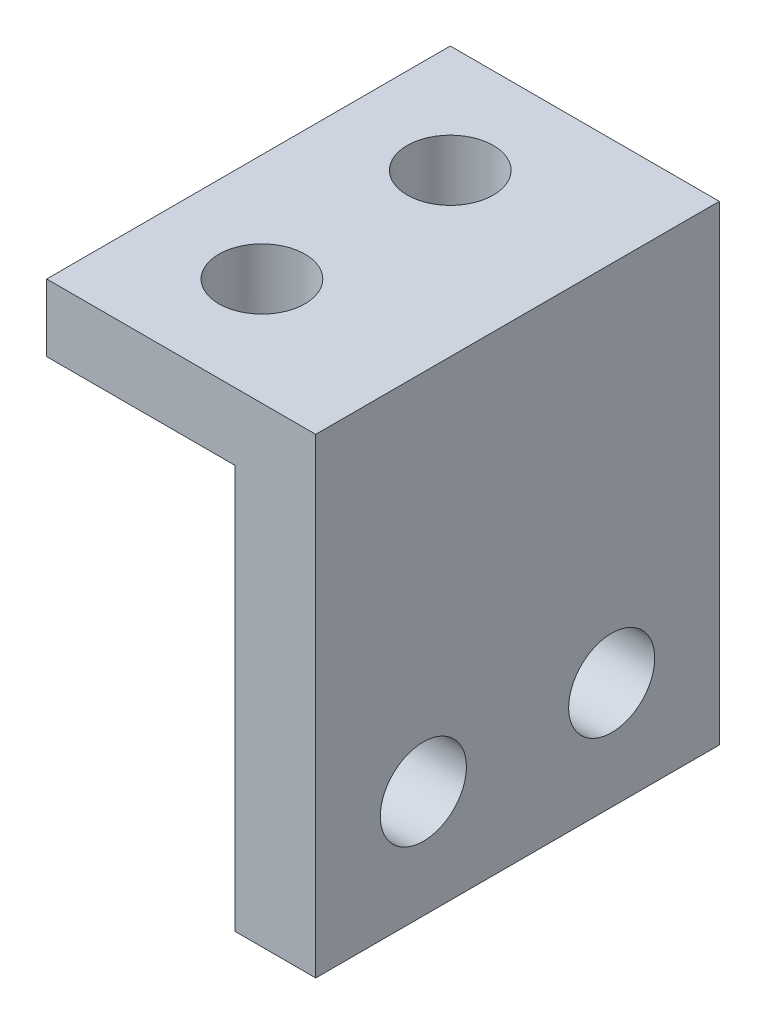
ISO-10303-21;
HEADER;
FILE_DESCRIPTION(('STEP AP214'),'2;1');
FILE_NAME('part.step','',(''),(''),'','','');
FILE_SCHEMA(('AUTOMOTIVE_DESIGN { 1 0 10303 214 1 1 1 1 }'));
ENDSEC;
DATA;
#1=APPLICATION_CONTEXT('core data for automotive mechanical design processes');
#2=APPLICATION_PROTOCOL_DEFINITION('international standard','automotive_design',2000,#1);
#3=PRODUCT_CONTEXT('',#1,'mechanical');
#4=PRODUCT('Part','Part','',(#3));
#5=PRODUCT_RELATED_PRODUCT_CATEGORY('part','',(#4));
#6=PRODUCT_DEFINITION_FORMATION('','',#4);
#7=PRODUCT_DEFINITION_CONTEXT('part definition',#1,'design');
#8=PRODUCT_DEFINITION('design','',#6,#7);
#9=PRODUCT_DEFINITION_SHAPE('','',#8);
#10=(LENGTH_UNIT() NAMED_UNIT(*) SI_UNIT(.MILLI.,.METRE.));
#11=(NAMED_UNIT(*) PLANE_ANGLE_UNIT() SI_UNIT($,.RADIAN.));
#12=(NAMED_UNIT(*) SI_UNIT($,.STERADIAN.) SOLID_ANGLE_UNIT());
#13=UNCERTAINTY_MEASURE_WITH_UNIT(LENGTH_MEASURE(1.E-05),#10,'distance_accuracy_value','');
#14=(GEOMETRIC_REPRESENTATION_CONTEXT(3) GLOBAL_UNCERTAINTY_ASSIGNED_CONTEXT((#13)) GLOBAL_UNIT_ASSIGNED_CONTEXT((#10,
#11,#12)) REPRESENTATION_CONTEXT('',''));
#15=CARTESIAN_POINT('',(0.,0.,0.));
#16=DIRECTION('',(0.,0.,1.));
#17=DIRECTION('',(1.,0.,0.));
#18=AXIS2_PLACEMENT_3D('',#15,#16,#17);
#19=CARTESIAN_POINT('',(0.,-15.,7.5));
#20=DIRECTION('',(1.,0.,0.));
#21=DIRECTION('',(0.,0.,-1.));
#22=AXIS2_PLACEMENT_3D('',#19,#20,#21);
#23=PLANE('',#22);
#24=DIRECTION('',(0.,0.,-1.));
#25=VECTOR('',#24,1.);
#26=CARTESIAN_POINT('',(0.,0.,7.5));
#27=LINE('',#26,#25);
#28=CARTESIAN_POINT('',(0.,0.,7.5));
#29=VERTEX_POINT('',#28);
#30=CARTESIAN_POINT('',(0.,0.,5.33303027798234));
#31=VERTEX_POINT('',#30);
#32=EDGE_CURVE('E207',#29,#31,#27,.T.);
#33=ORIENTED_EDGE('',*,*,#32,.T.);
#34=DIRECTION('',(0.,-1.,0.));
#35=VECTOR('',#34,1.);
#36=CARTESIAN_POINT('',(0.,7.07106781186548,5.33303027798234));
#37=LINE('',#36,#35);
#38=CARTESIAN_POINT('',(0.,-15.,5.33303027798234));
#39=VERTEX_POINT('',#38);
#40=EDGE_CURVE('E235',#31,#39,#37,.T.);
#41=ORIENTED_EDGE('',*,*,#40,.T.);
#42=DIRECTION('',(0.,0.,-1.));
#43=VECTOR('',#42,1.);
#44=CARTESIAN_POINT('',(0.,-15.,7.5));
#45=LINE('',#44,#43);
#46=CARTESIAN_POINT('',(0.,-15.,7.5));
#47=VERTEX_POINT('',#46);
#48=EDGE_CURVE('E11',#47,#39,#45,.T.);
#49=ORIENTED_EDGE('',*,*,#48,.F.);
#50=DIRECTION('',(0.,-1.,0.));
#51=VECTOR('',#50,1.);
#52=CARTESIAN_POINT('',(0.,-15.,7.5));
#53=LINE('',#52,#51);
#54=EDGE_CURVE('E206',#29,#47,#53,.T.);
#55=ORIENTED_EDGE('',*,*,#54,.F.);
#56=EDGE_LOOP('',(#33,#41,#49,#55));
#57=FACE_BOUND('',#56,.T.);
#58=ADVANCED_FACE('F37',(#57),#23,.F.);
#59=CARTESIAN_POINT('',(0.,-15.,1.66696972201766));
#60=VERTEX_POINT('',#59);
#61=CARTESIAN_POINT('',(0.,-15.,-1.66696972201766));
#62=VERTEX_POINT('',#61);
#63=EDGE_CURVE('E51',#60,#62,#45,.T.);
#64=ORIENTED_EDGE('',*,*,#63,.F.);
#65=DIRECTION('',(0.,-1.,0.));
#66=VECTOR('',#65,1.);
#67=CARTESIAN_POINT('',(0.,7.07106781186548,1.66696972201766));
#68=LINE('',#67,#66);
#69=CARTESIAN_POINT('',(0.,0.,1.66696972201766));
#70=VERTEX_POINT('',#69);
#71=EDGE_CURVE('E68',#60,#70,#68,.F.);
#72=ORIENTED_EDGE('',*,*,#71,.T.);
#73=CARTESIAN_POINT('',(0.,0.,-1.66696972201766));
#74=VERTEX_POINT('',#73);
#75=EDGE_CURVE('E135',#70,#74,#27,.T.);
#76=ORIENTED_EDGE('',*,*,#75,.T.);
#77=DIRECTION('',(0.,-1.,0.));
#78=VECTOR('',#77,1.);
#79=CARTESIAN_POINT('',(0.,7.07106781186548,-1.66696972201766));
#80=LINE('',#79,#78);
#81=EDGE_CURVE('E122',#74,#62,#80,.T.);
#82=ORIENTED_EDGE('',*,*,#81,.T.);
#83=EDGE_LOOP('',(#64,#72,#76,#82));
#84=FACE_BOUND('',#83,.T.);
#85=ADVANCED_FACE('F133',(#84),#23,.F.);
#86=CARTESIAN_POINT('',(0.,-15.,-5.33303027798234));
#87=VERTEX_POINT('',#86);
#88=CARTESIAN_POINT('',(0.,-15.,-7.5));
#89=VERTEX_POINT('',#88);
#90=EDGE_CURVE('E53',#87,#89,#45,.T.);
#91=ORIENTED_EDGE('',*,*,#90,.F.);
#92=DIRECTION('',(0.,-1.,0.));
#93=VECTOR('',#92,1.);
#94=CARTESIAN_POINT('',(0.,7.07106781186548,-5.33303027798234));
#95=LINE('',#94,#93);
#96=CARTESIAN_POINT('',(0.,0.,-5.33303027798234));
#97=VERTEX_POINT('',#96);
#98=EDGE_CURVE('E60',#87,#97,#95,.F.);
#99=ORIENTED_EDGE('',*,*,#98,.T.);
#100=CARTESIAN_POINT('',(0.,0.,-7.5));
#101=VERTEX_POINT('',#100);
#102=EDGE_CURVE('E210',#97,#101,#27,.T.);
#103=ORIENTED_EDGE('',*,*,#102,.T.);
#104=DIRECTION('',(0.,-1.,0.));
#105=VECTOR('',#104,1.);
#106=CARTESIAN_POINT('',(0.,-15.,-7.5));
#107=LINE('',#106,#105);
#108=EDGE_CURVE('E148',#101,#89,#107,.T.);
#109=ORIENTED_EDGE('',*,*,#108,.T.);
#110=EDGE_LOOP('',(#91,#99,#103,#109));
#111=FACE_BOUND('',#110,.T.);
#112=ADVANCED_FACE('F39',(#111),#23,.F.);
#113=CARTESIAN_POINT('',(3.,-15.,7.5));
#114=DIRECTION('',(0.,1.,0.));
#115=DIRECTION('',(0.,0.,1.));
#116=AXIS2_PLACEMENT_3D('',#113,#114,#115);
#117=PLANE('',#116);
#118=ORIENTED_EDGE('',*,*,#48,.T.);
#119=CARTESIAN_POINT('',(-1.7,-15.,3.5));
#120=DIRECTION('',(0.,-1.,0.));
#121=DIRECTION('',(0.,0.,-1.));
#122=AXIS2_PLACEMENT_3D('',#119,#120,#121);
#123=CIRCLE('',#122,2.5);
#124=EDGE_CURVE('E127',#60,#39,#123,.T.);
#125=ORIENTED_EDGE('',*,*,#124,.F.);
#126=ORIENTED_EDGE('',*,*,#63,.T.);
#127=CARTESIAN_POINT('',(-1.7,-15.,-3.5));
#128=DIRECTION('',(0.,-1.,0.));
#129=DIRECTION('',(0.,0.,-1.));
#130=AXIS2_PLACEMENT_3D('',#127,#128,#129);
#131=CIRCLE('',#130,2.5);
#132=EDGE_CURVE('E119',#87,#62,#131,.T.);
#133=ORIENTED_EDGE('',*,*,#132,.F.);
#134=ORIENTED_EDGE('',*,*,#90,.T.);
#135=DIRECTION('',(1.,0.,0.));
#136=VECTOR('',#135,1.);
#137=CARTESIAN_POINT('',(3.,-15.,-7.5));
#138=LINE('',#137,#136);
#139=CARTESIAN_POINT('',(3.,-15.,-7.5));
#140=VERTEX_POINT('',#139);
#141=EDGE_CURVE('E186',#89,#140,#138,.T.);
#142=ORIENTED_EDGE('',*,*,#141,.T.);
#143=DIRECTION('',(0.,0.,-1.));
#144=VECTOR('',#143,1.);
#145=CARTESIAN_POINT('',(3.,-15.,7.5));
#146=LINE('',#145,#144);
#147=CARTESIAN_POINT('',(3.,-15.,7.5));
#148=VERTEX_POINT('',#147);
#149=EDGE_CURVE('E138',#148,#140,#146,.T.);
#150=ORIENTED_EDGE('',*,*,#149,.F.);
#151=DIRECTION('',(1.,0.,0.));
#152=VECTOR('',#151,1.);
#153=CARTESIAN_POINT('',(3.,-15.,7.5));
#154=LINE('',#153,#152);
#155=EDGE_CURVE('E223',#47,#148,#154,.T.);
#156=ORIENTED_EDGE('',*,*,#155,.F.);
#157=EDGE_LOOP('',(#118,#125,#126,#133,#134,#142,#150,#156));
#158=FACE_BOUND('',#157,.T.);
#159=ADVANCED_FACE('F137',(#158),#117,.F.);
#160=CARTESIAN_POINT('',(3.,2.5,7.5));
#161=DIRECTION('',(-1.,0.,0.));
#162=DIRECTION('',(0.,-1.,0.));
#163=AXIS2_PLACEMENT_3D('',#160,#161,#162);
#164=PLANE('',#163);
#165=CARTESIAN_POINT('',(3.,-11.,-3.5));
#166=DIRECTION('',(1.,0.,0.));
#167=DIRECTION('',(0.,1.,0.));
#168=AXIS2_PLACEMENT_3D('',#165,#166,#167);
#169=CIRCLE('',#168,1.6);
#170=CARTESIAN_POINT('',(3.,-9.4,-3.5));
#171=VERTEX_POINT('',#170);
#172=EDGE_CURVE('E240',#171,#171,#169,.T.);
#173=ORIENTED_EDGE('',*,*,#172,.F.);
#174=EDGE_LOOP('',(#173));
#175=FACE_BOUND('',#174,.T.);
#176=CARTESIAN_POINT('',(3.,-11.,3.5));
#177=DIRECTION('',(1.,0.,0.));
#178=DIRECTION('',(0.,1.,0.));
#179=AXIS2_PLACEMENT_3D('',#176,#177,#178);
#180=CIRCLE('',#179,1.6);
#181=CARTESIAN_POINT('',(3.,-9.4,3.5));
#182=VERTEX_POINT('',#181);
#183=EDGE_CURVE('E237',#182,#182,#180,.T.);
#184=ORIENTED_EDGE('',*,*,#183,.F.);
#185=EDGE_LOOP('',(#184));
#186=FACE_BOUND('',#185,.T.);
#187=DIRECTION('',(0.,1.,0.));
#188=VECTOR('',#187,1.);
#189=CARTESIAN_POINT('',(3.,2.5,-7.5));
#190=LINE('',#189,#188);
#191=CARTESIAN_POINT('',(3.,2.5,-7.5));
#192=VERTEX_POINT('',#191);
#193=EDGE_CURVE('E193',#140,#192,#190,.T.);
#194=ORIENTED_EDGE('',*,*,#193,.T.);
#195=DIRECTION('',(0.,0.,-1.));
#196=VECTOR('',#195,1.);
#197=CARTESIAN_POINT('',(3.,2.5,7.5));
#198=LINE('',#197,#196);
#199=CARTESIAN_POINT('',(3.,2.5,7.5));
#200=VERTEX_POINT('',#199);
#201=EDGE_CURVE('E215',#200,#192,#198,.T.);
#202=ORIENTED_EDGE('',*,*,#201,.F.);
#203=DIRECTION('',(0.,1.,0.));
#204=VECTOR('',#203,1.);
#205=CARTESIAN_POINT('',(3.,2.5,7.5));
#206=LINE('',#205,#204);
#207=EDGE_CURVE('E222',#148,#200,#206,.T.);
#208=ORIENTED_EDGE('',*,*,#207,.F.);
#209=ORIENTED_EDGE('',*,*,#149,.T.);
#210=EDGE_LOOP('',(#194,#202,#208,#209));
#211=FACE_BOUND('',#210,.T.);
#212=ADVANCED_FACE('F180',(#175,#186,#211),#164,.F.);
#213=CARTESIAN_POINT('',(-7.,2.5,7.5));
#214=DIRECTION('',(0.,-1.,0.));
#215=DIRECTION('',(0.,0.,-1.));
#216=AXIS2_PLACEMENT_3D('',#213,#214,#215);
#217=PLANE('',#216);
#218=CARTESIAN_POINT('',(-3.,2.5,-3.5));
#219=DIRECTION('',(0.,1.,0.));
#220=DIRECTION('',(0.,0.,1.));
#221=AXIS2_PLACEMENT_3D('',#218,#219,#220);
#222=CIRCLE('',#221,1.6);
#223=CARTESIAN_POINT('',(-3.,2.5,-1.9));
#224=VERTEX_POINT('',#223);
#225=EDGE_CURVE('E146',#224,#224,#222,.T.);
#226=ORIENTED_EDGE('',*,*,#225,.F.);
#227=EDGE_LOOP('',(#226));
#228=FACE_BOUND('',#227,.T.);
#229=CARTESIAN_POINT('',(-3.,2.5,3.5));
#230=DIRECTION('',(0.,1.,0.));
#231=DIRECTION('',(0.,0.,1.));
#232=AXIS2_PLACEMENT_3D('',#229,#230,#231);
#233=CIRCLE('',#232,1.6);
#234=CARTESIAN_POINT('',(-3.,2.5,5.1));
#235=VERTEX_POINT('',#234);
#236=EDGE_CURVE('E245',#235,#235,#233,.T.);
#237=ORIENTED_EDGE('',*,*,#236,.F.);
#238=EDGE_LOOP('',(#237));
#239=FACE_BOUND('',#238,.T.);
#240=DIRECTION('',(-1.,0.,0.));
#241=VECTOR('',#240,1.);
#242=CARTESIAN_POINT('',(-7.,2.5,-7.5));
#243=LINE('',#242,#241);
#244=CARTESIAN_POINT('',(-7.,2.5,-7.5));
#245=VERTEX_POINT('',#244);
#246=EDGE_CURVE('E195',#192,#245,#243,.T.);
#247=ORIENTED_EDGE('',*,*,#246,.T.);
#248=DIRECTION('',(0.,0.,-1.));
#249=VECTOR('',#248,1.);
#250=CARTESIAN_POINT('',(-7.,2.5,7.5));
#251=LINE('',#250,#249);
#252=CARTESIAN_POINT('',(-7.,2.5,7.5));
#253=VERTEX_POINT('',#252);
#254=EDGE_CURVE('E213',#253,#245,#251,.T.);
#255=ORIENTED_EDGE('',*,*,#254,.F.);
#256=DIRECTION('',(-1.,0.,0.));
#257=VECTOR('',#256,1.);
#258=CARTESIAN_POINT('',(-7.,2.5,7.5));
#259=LINE('',#258,#257);
#260=EDGE_CURVE('E252',#200,#253,#259,.T.);
#261=ORIENTED_EDGE('',*,*,#260,.F.);
#262=ORIENTED_EDGE('',*,*,#201,.T.);
#263=EDGE_LOOP('',(#247,#255,#261,#262));
#264=FACE_BOUND('',#263,.T.);
#265=ADVANCED_FACE('F264',(#228,#239,#264),#217,.F.);
#266=CARTESIAN_POINT('',(-7.,0.,7.5));
#267=DIRECTION('',(1.,0.,0.));
#268=DIRECTION('',(0.,0.,-1.));
#269=AXIS2_PLACEMENT_3D('',#266,#267,#268);
#270=PLANE('',#269);
#271=DIRECTION('',(0.,-1.,0.));
#272=VECTOR('',#271,1.);
#273=CARTESIAN_POINT('',(-7.,0.,-7.5));
#274=LINE('',#273,#272);
#275=CARTESIAN_POINT('',(-7.,0.,-7.5));
#276=VERTEX_POINT('',#275);
#277=EDGE_CURVE('E201',#245,#276,#274,.T.);
#278=ORIENTED_EDGE('',*,*,#277,.T.);
#279=DIRECTION('',(0.,0.,-1.));
#280=VECTOR('',#279,1.);
#281=CARTESIAN_POINT('',(-7.,0.,7.5));
#282=LINE('',#281,#280);
#283=CARTESIAN_POINT('',(-7.,0.,7.5));
#284=VERTEX_POINT('',#283);
#285=EDGE_CURVE('E209',#284,#276,#282,.T.);
#286=ORIENTED_EDGE('',*,*,#285,.F.);
#287=DIRECTION('',(0.,-1.,0.));
#288=VECTOR('',#287,1.);
#289=CARTESIAN_POINT('',(-7.,0.,7.5));
#290=LINE('',#289,#288);
#291=EDGE_CURVE('E254',#253,#284,#290,.T.);
#292=ORIENTED_EDGE('',*,*,#291,.F.);
#293=ORIENTED_EDGE('',*,*,#254,.T.);
#294=EDGE_LOOP('',(#278,#286,#292,#293));
#295=FACE_BOUND('',#294,.T.);
#296=ADVANCED_FACE('F261',(#295),#270,.F.);
#297=CARTESIAN_POINT('',(0.,0.,7.5));
#298=DIRECTION('',(0.,1.,0.));
#299=DIRECTION('',(-1.,0.,0.));
#300=AXIS2_PLACEMENT_3D('',#297,#298,#299);
#301=PLANE('',#300);
#302=ORIENTED_EDGE('',*,*,#75,.F.);
#303=CARTESIAN_POINT('',(-1.7,0.,3.5));
#304=DIRECTION('',(0.,1.,0.));
#305=DIRECTION('',(-1.,0.,0.));
#306=AXIS2_PLACEMENT_3D('',#303,#304,#305);
#307=CIRCLE('',#306,2.5);
#308=EDGE_CURVE('E156',#70,#31,#307,.F.);
#309=ORIENTED_EDGE('',*,*,#308,.T.);
#310=ORIENTED_EDGE('',*,*,#32,.F.);
#311=DIRECTION('',(1.,0.,0.));
#312=VECTOR('',#311,1.);
#313=CARTESIAN_POINT('',(0.,0.,7.5));
#314=LINE('',#313,#312);
#315=EDGE_CURVE('E231',#284,#29,#314,.T.);
#316=ORIENTED_EDGE('',*,*,#315,.F.);
#317=ORIENTED_EDGE('',*,*,#285,.T.);
#318=DIRECTION('',(1.,0.,0.));
#319=VECTOR('',#318,1.);
#320=CARTESIAN_POINT('',(0.,0.,-7.5));
#321=LINE('',#320,#319);
#322=EDGE_CURVE('E203',#276,#101,#321,.T.);
#323=ORIENTED_EDGE('',*,*,#322,.T.);
#324=ORIENTED_EDGE('',*,*,#102,.F.);
#325=CARTESIAN_POINT('',(-1.7,0.,-3.5));
#326=DIRECTION('',(0.,1.,0.));
#327=DIRECTION('',(-1.,0.,0.));
#328=AXIS2_PLACEMENT_3D('',#325,#326,#327);
#329=CIRCLE('',#328,2.5);
#330=EDGE_CURVE('E128',#97,#74,#329,.F.);
#331=ORIENTED_EDGE('',*,*,#330,.T.);
#332=EDGE_LOOP('',(#302,#309,#310,#316,#317,#323,#324,#331));
#333=FACE_BOUND('',#332,.T.);
#334=CARTESIAN_POINT('',(-3.,0.,3.5));
#335=DIRECTION('',(0.,1.,0.));
#336=DIRECTION('',(-1.,0.,0.));
#337=AXIS2_PLACEMENT_3D('',#334,#335,#336);
#338=CIRCLE('',#337,1.6);
#339=CARTESIAN_POINT('',(-4.6,0.,3.5));
#340=VERTEX_POINT('',#339);
#341=EDGE_CURVE('E142',#340,#340,#338,.T.);
#342=ORIENTED_EDGE('',*,*,#341,.T.);
#343=EDGE_LOOP('',(#342));
#344=FACE_BOUND('',#343,.T.);
#345=CARTESIAN_POINT('',(-3.,0.,-3.5));
#346=DIRECTION('',(0.,1.,0.));
#347=DIRECTION('',(-1.,0.,0.));
#348=AXIS2_PLACEMENT_3D('',#345,#346,#347);
#349=CIRCLE('',#348,1.6);
#350=CARTESIAN_POINT('',(-4.6,0.,-3.5));
#351=VERTEX_POINT('',#350);
#352=EDGE_CURVE('E145',#351,#351,#349,.T.);
#353=ORIENTED_EDGE('',*,*,#352,.T.);
#354=EDGE_LOOP('',(#353));
#355=FACE_BOUND('',#354,.T.);
#356=ADVANCED_FACE('F256',(#333,#344,#355),#301,.F.);
#357=CARTESIAN_POINT('',(0.,0.,7.5));
#358=DIRECTION('',(0.,0.,1.));
#359=DIRECTION('',(1.,0.,0.));
#360=AXIS2_PLACEMENT_3D('',#357,#358,#359);
#361=PLANE('',#360);
#362=ORIENTED_EDGE('',*,*,#54,.T.);
#363=ORIENTED_EDGE('',*,*,#155,.T.);
#364=ORIENTED_EDGE('',*,*,#207,.T.);
#365=ORIENTED_EDGE('',*,*,#260,.T.);
#366=ORIENTED_EDGE('',*,*,#291,.T.);
#367=ORIENTED_EDGE('',*,*,#315,.T.);
#368=EDGE_LOOP('',(#362,#363,#364,#365,#366,#367));
#369=FACE_BOUND('',#368,.T.);
#370=ADVANCED_FACE('F229',(#369),#361,.T.);
#371=CARTESIAN_POINT('',(0.,0.,-7.5));
#372=DIRECTION('',(0.,0.,1.));
#373=DIRECTION('',(1.,0.,0.));
#374=AXIS2_PLACEMENT_3D('',#371,#372,#373);
#375=PLANE('',#374);
#376=ORIENTED_EDGE('',*,*,#108,.F.);
#377=ORIENTED_EDGE('',*,*,#322,.F.);
#378=ORIENTED_EDGE('',*,*,#277,.F.);
#379=ORIENTED_EDGE('',*,*,#246,.F.);
#380=ORIENTED_EDGE('',*,*,#193,.F.);
#381=ORIENTED_EDGE('',*,*,#141,.F.);
#382=EDGE_LOOP('',(#376,#377,#378,#379,#380,#381));
#383=FACE_BOUND('',#382,.T.);
#384=ADVANCED_FACE('F190',(#383),#375,.F.);
#385=CARTESIAN_POINT('',(-3.,-12.5,3.5));
#386=DIRECTION('',(0.,1.,0.));
#387=DIRECTION('',(0.,0.,1.));
#388=AXIS2_PLACEMENT_3D('',#385,#386,#387);
#389=CYLINDRICAL_SURFACE('',#388,1.6);
#390=ORIENTED_EDGE('',*,*,#236,.T.);
#391=EDGE_LOOP('',(#390));
#392=FACE_BOUND('',#391,.T.);
#393=ORIENTED_EDGE('',*,*,#341,.F.);
#394=EDGE_LOOP('',(#393));
#395=FACE_BOUND('',#394,.T.);
#396=ADVANCED_FACE('F282',(#392,#395),#389,.F.);
#397=CARTESIAN_POINT('',(-3.,-12.5,-3.5));
#398=DIRECTION('',(0.,1.,0.));
#399=DIRECTION('',(0.,0.,1.));
#400=AXIS2_PLACEMENT_3D('',#397,#398,#399);
#401=CYLINDRICAL_SURFACE('',#400,1.6);
#402=ORIENTED_EDGE('',*,*,#225,.T.);
#403=EDGE_LOOP('',(#402));
#404=FACE_BOUND('',#403,.T.);
#405=ORIENTED_EDGE('',*,*,#352,.F.);
#406=EDGE_LOOP('',(#405));
#407=FACE_BOUND('',#406,.T.);
#408=ADVANCED_FACE('F287',(#404,#407),#401,.F.);
#409=CARTESIAN_POINT('',(-12.,-11.,3.5));
#410=DIRECTION('',(1.,0.,0.));
#411=DIRECTION('',(0.,1.,0.));
#412=AXIS2_PLACEMENT_3D('',#409,#410,#411);
#413=CYLINDRICAL_SURFACE('',#412,1.6);
#414=CARTESIAN_POINT('',(0.8,-9.4,3.5));
#415=CARTESIAN_POINT('',(0.799993734781216,-9.40000680047397,3.41905347086729));
#416=CARTESIAN_POINT('',(0.796028004832289,-9.40618441943112,3.33802128576068));
#417=CARTESIAN_POINT('',(0.780538808515944,-9.43055504248469,3.17846775912249));
#418=CARTESIAN_POINT('',(0.76900276007789,-9.44876805006948,3.09995082626189));
#419=CARTESIAN_POINT('',(0.739528043747612,-9.49612562317563,2.94803789641589));
#420=CARTESIAN_POINT('',(0.721621240502472,-9.52521582045597,2.87461854865567));
#421=CARTESIAN_POINT('',(0.680877106071852,-9.59311966598306,2.733975820197));
#422=CARTESIAN_POINT('',(0.658040065430923,-9.63193274127105,2.66675207471756));
#423=CARTESIAN_POINT('',(0.607088939041706,-9.72166636612742,2.53419198620883));
#424=CARTESIAN_POINT('',(0.578696040045425,-9.77331744661622,2.46945950090291));
#425=CARTESIAN_POINT('',(0.520287651253396,-9.88556011964052,2.34899385146012));
#426=CARTESIAN_POINT('',(0.490269953446056,-9.94616408225527,2.29327336586461));
#427=CARTESIAN_POINT('',(0.426821604768736,-10.0847366361186,2.18426968248771));
#428=CARTESIAN_POINT('',(0.393518567772843,-10.1639490825274,2.13248095470177));
#429=CARTESIAN_POINT('',(0.332316417222743,-10.3318852127664,2.04307473791189));
#430=CARTESIAN_POINT('',(0.30440807432674,-10.4205922416636,2.0054329399756));
#431=CARTESIAN_POINT('',(0.265069414510948,-10.5807367744922,1.95428005378075));
#432=CARTESIAN_POINT('',(0.251224625000579,-10.6503719646459,1.93699796688561));
#433=CARTESIAN_POINT('',(0.230859746570652,-10.792331757637,1.91190366804613));
#434=CARTESIAN_POINT('',(0.224328525198427,-10.8646520993734,1.90407706186956));
#435=CARTESIAN_POINT('',(0.219584009712025,-11.0101936169191,1.89837130520484));
#436=CARTESIAN_POINT('',(0.221396429831094,-11.0834168830375,1.90052290666297));
#437=CARTESIAN_POINT('',(0.233100419340934,-11.2282656231058,1.91469232376697));
#438=CARTESIAN_POINT('',(0.242998654784565,-11.2998897286165,1.92671828000321));
#439=CARTESIAN_POINT('',(0.269012313205562,-11.4375605431863,1.95941416563174));
#440=CARTESIAN_POINT('',(0.284933778633899,-11.50370983345,1.97981596902759));
#441=CARTESIAN_POINT('',(0.321221658802754,-11.6317554386829,2.02840886894182));
#442=CARTESIAN_POINT('',(0.341589549588552,-11.6936503323602,2.05660255289885));
#443=CARTESIAN_POINT('',(0.389226270373412,-11.8241627078174,2.12623323240365));
#444=CARTESIAN_POINT('',(0.41706797105538,-11.8917663186458,2.16917679484868));
#445=CARTESIAN_POINT('',(0.473995698176093,-12.0195754613445,2.26435235644601));
#446=CARTESIAN_POINT('',(0.503083167557381,-12.0797720833625,2.31659536067019));
#447=CARTESIAN_POINT('',(0.565432852115933,-12.2022695069461,2.44008193831996));
#448=CARTESIAN_POINT('',(0.598489206853807,-12.262952614846,2.5130531067318));
#449=CARTESIAN_POINT('',(0.659688609273001,-12.3711735358124,2.66997703190611));
#450=CARTESIAN_POINT('',(0.687836893973343,-12.4187253922443,2.75391791428156));
#451=CARTESIAN_POINT('',(0.731311409199622,-12.4906100773492,2.91336444900826));
#452=CARTESIAN_POINT('',(0.748073109221673,-12.5176766485888,2.98724607158572));
#453=CARTESIAN_POINT('',(0.775041807517473,-12.5608068219445,3.13928982418349));
#454=CARTESIAN_POINT('',(0.785254074006904,-12.57687926818,3.21744845880441));
#455=CARTESIAN_POINT('',(0.798205143054326,-12.5972136375606,3.37618436530499));
#456=CARTESIAN_POINT('',(0.800918883162938,-12.6014359545581,3.45676884029644));
#457=CARTESIAN_POINT('',(0.798528871980755,-12.5977010941476,3.61754228628956));
#458=CARTESIAN_POINT('',(0.79342466188541,-12.5897432019313,3.69773123380223));
#459=CARTESIAN_POINT('',(0.776374513766733,-12.5628596082556,3.85100615666102));
#460=CARTESIAN_POINT('',(0.764806635522481,-12.5445393309926,3.92424312684957));
#461=CARTESIAN_POINT('',(0.736070379650052,-12.4982547004026,4.06641548443588));
#462=CARTESIAN_POINT('',(0.718901060507767,-12.4702887257403,4.13535014636117));
#463=CARTESIAN_POINT('',(0.678771184622544,-12.4033262179422,4.27261556435252));
#464=CARTESIAN_POINT('',(0.65547539636836,-12.3636650823683,4.34052181488745));
#465=CARTESIAN_POINT('',(0.605584825993552,-12.2755549532504,4.46904100986565));
#466=CARTESIAN_POINT('',(0.578987489863377,-12.2270991427663,4.52964823562874));
#467=CARTESIAN_POINT('',(0.520164030440381,-12.1143562511495,4.65157305211655));
#468=CARTESIAN_POINT('',(0.487698432535419,-12.0487816499282,4.71158689465292));
#469=CARTESIAN_POINT('',(0.423908738275008,-11.9082457887994,4.8202194969544));
#470=CARTESIAN_POINT('',(0.392584867257356,-11.8332826887363,4.86883601745304));
#471=CARTESIAN_POINT('',(0.338646595893202,-11.6856569513892,4.94771753628644));
#472=CARTESIAN_POINT('',(0.315427004800475,-11.6140750306084,4.97958112170677));
#473=CARTESIAN_POINT('',(0.275240437851751,-11.465474272812,5.03282212869392));
#474=CARTESIAN_POINT('',(0.258264788546573,-11.3884631561667,5.05421411012882));
#475=CARTESIAN_POINT('',(0.233052689364862,-11.2298827434214,5.08547514853105));
#476=CARTESIAN_POINT('',(0.224899975701913,-11.1482773750066,5.09523388426508));
#477=CARTESIAN_POINT('',(0.219257647409102,-10.984190966045,5.10202308952287));
#478=CARTESIAN_POINT('',(0.221760292387579,-10.9017106045544,5.09906279853819));
#479=CARTESIAN_POINT('',(0.235770774082169,-10.7509158292655,5.082047659125));
#480=CARTESIAN_POINT('',(0.245929632402229,-10.6822721630591,5.06965222422199));
#481=CARTESIAN_POINT('',(0.272248443675268,-10.5482348574803,5.03645153543922));
#482=CARTESIAN_POINT('',(0.288414345010851,-10.4828445126814,5.01563794379522));
#483=CARTESIAN_POINT('',(0.331325595297563,-10.3344665364572,4.95787799915052));
#484=CARTESIAN_POINT('',(0.359796886021954,-10.2531823017417,4.91784373882589));
#485=CARTESIAN_POINT('',(0.420392108454369,-10.0994015171681,4.82551551302481));
#486=CARTESIAN_POINT('',(0.452520941629232,-10.0269170349794,4.77320499415655));
#487=CARTESIAN_POINT('',(0.517345612307383,-9.89084041893917,4.65666472100032));
#488=CARTESIAN_POINT('',(0.55004367113503,-9.8273630687015,4.59230184419141));
#489=CARTESIAN_POINT('',(0.612511350771649,-9.71155823938721,4.4529589392922));
#490=CARTESIAN_POINT('',(0.642280914318267,-9.65923097831061,4.3779787036652));
#491=CARTESIAN_POINT('',(0.696866351302167,-9.56596841125401,4.21591203269398));
#492=CARTESIAN_POINT('',(0.721495298791624,-9.52544676788268,4.1285172004562));
#493=CARTESIAN_POINT('',(0.751582273551255,-9.47671020894649,3.99186762890933));
#494=CARTESIAN_POINT('',(0.760464254028589,-9.46247876927214,3.94543000315536));
#495=CARTESIAN_POINT('',(0.775686426147103,-9.43823364569895,3.85107264809978));
#496=CARTESIAN_POINT('',(0.782028393942442,-9.42821701426303,3.8031539797922));
#497=CARTESIAN_POINT('',(0.79128524954684,-9.41364281149136,3.71278519857304));
#498=CARTESIAN_POINT('',(0.794544420579377,-9.40853530189393,3.67045819183563));
#499=CARTESIAN_POINT('',(0.798903473716205,-9.40171206304033,3.58542875053602));
#500=CARTESIAN_POINT('',(0.800003306993731,-9.39999641048053,3.54272630750642));
#501=CARTESIAN_POINT('',(0.8,-9.4,3.5));
#502=B_SPLINE_CURVE_WITH_KNOTS('',3,(#414,#415,#416,#417,#418,#419,#420,#421,#422,#423,#424,
#425,#426,#427,#428,#429,#430,#431,#432,#433,#434,#435,#436,#437,#438,#439,#440,#441,#442,#443,
#444,#445,#446,#447,#448,#449,#450,#451,#452,#453,#454,#455,#456,#457,#458,#459,#460,#461,#462,
#463,#464,#465,#466,#467,#468,#469,#470,#471,#472,#473,#474,#475,#476,#477,#478,#479,#480,#481,
#482,#483,#484,#485,#486,#487,#488,#489,#490,#491,#492,#493,#494,#495,#496,#497,#498,#499,#500,
#501),.UNSPECIFIED.,.T.,.F.,(4,2,2,2,2,2,2,2,2,2,2,2,2,2,2,2,2,2,2,2,2,2,2,2,2,2,2,2,2,2,2,2,2,
2,2,2,2,2,2,2,2,2,2,4),(0.,0.242668102535663,0.485740550885228,0.727613930252439,
0.969473059632696,1.23110984524596,1.4931115719164,1.79267227249295,2.09171585301315,
2.31003384448275,2.52801906643514,2.74667654507805,2.96551446997264,3.17783438970215,
3.39022489909452,3.64367853296952,3.89743412554235,4.1974590010126,4.49716175776393,
4.7374824656454,4.9776096217435,5.21853839358544,5.459481305125,5.68761800492927,
5.91579307069755,6.1609022281819,6.40620219274237,6.68894601761175,6.97174534754924,
7.21597374489126,7.45986159214767,7.70604434827074,7.95204829992844,8.16261918551679,
8.37339914379897,8.65683208165382,8.94064942091189,9.22780941070396,9.51497501436514,
9.81124287919981,9.95914584209686,10.1069451995842,10.2350307103854,10.3631191174119),.UNSPECIFIED.);
#503=CARTESIAN_POINT('',(0.8,-9.4,3.5));
#504=VERTEX_POINT('',#503);
#505=EDGE_CURVE('E41',#504,#504,#502,.T.);
#506=ORIENTED_EDGE('',*,*,#505,.T.);
#507=EDGE_LOOP('',(#506));
#508=FACE_BOUND('',#507,.T.);
#509=ORIENTED_EDGE('',*,*,#183,.T.);
#510=EDGE_LOOP('',(#509));
#511=FACE_BOUND('',#510,.T.);
#512=ADVANCED_FACE('F290',(#508,#511),#413,.F.);
#513=CARTESIAN_POINT('',(-12.,-11.,-3.5));
#514=DIRECTION('',(1.,0.,0.));
#515=DIRECTION('',(0.,1.,0.));
#516=AXIS2_PLACEMENT_3D('',#513,#514,#515);
#517=CYLINDRICAL_SURFACE('',#516,1.6);
#518=CARTESIAN_POINT('',(0.8,-9.4,-3.5));
#519=CARTESIAN_POINT('',(0.799993734781215,-9.40000680047397,-3.58094652913271));
#520=CARTESIAN_POINT('',(0.796028004832289,-9.40618441943112,-3.66197871423932));
#521=CARTESIAN_POINT('',(0.780538808515944,-9.43055504248469,-3.82153224087751));
#522=CARTESIAN_POINT('',(0.76900276007789,-9.44876805006948,-3.90004917373811));
#523=CARTESIAN_POINT('',(0.739528043747612,-9.49612562317563,-4.05196210358411));
#524=CARTESIAN_POINT('',(0.721621240502472,-9.52521582045597,-4.12538145134433));
#525=CARTESIAN_POINT('',(0.680877106071852,-9.59311966598306,-4.266024179803));
#526=CARTESIAN_POINT('',(0.658040065430923,-9.63193274127105,-4.33324792528244));
#527=CARTESIAN_POINT('',(0.607088939041706,-9.72166636612742,-4.46580801379117));
#528=CARTESIAN_POINT('',(0.578696040045426,-9.77331744661622,-4.53054049909709));
#529=CARTESIAN_POINT('',(0.520287651253397,-9.88556011964052,-4.65100614853988));
#530=CARTESIAN_POINT('',(0.490269953446056,-9.94616408225527,-4.70672663413539));
#531=CARTESIAN_POINT('',(0.426821604768736,-10.0847366361186,-4.81573031751229));
#532=CARTESIAN_POINT('',(0.393518567772843,-10.1639490825274,-4.86751904529823));
#533=CARTESIAN_POINT('',(0.332316417222743,-10.3318852127664,-4.95692526208811));
#534=CARTESIAN_POINT('',(0.304408074326741,-10.4205922416636,-4.9945670600244));
#535=CARTESIAN_POINT('',(0.265069414510949,-10.5807367744922,-5.04571994621925));
#536=CARTESIAN_POINT('',(0.25122462500058,-10.6503719646459,-5.06300203311439));
#537=CARTESIAN_POINT('',(0.230859746570652,-10.792331757637,-5.08809633195387));
#538=CARTESIAN_POINT('',(0.224328525198427,-10.8646520993734,-5.09592293813044));
#539=CARTESIAN_POINT('',(0.219584009712025,-11.0101936169191,-5.10162869479516));
#540=CARTESIAN_POINT('',(0.221396429831093,-11.0834168830374,-5.09947709333703));
#541=CARTESIAN_POINT('',(0.233100419340933,-11.2282656231058,-5.08530767623304));
#542=CARTESIAN_POINT('',(0.242998654784564,-11.2998897286165,-5.07328171999679));
#543=CARTESIAN_POINT('',(0.269012313205561,-11.4375605431863,-5.04058583436826));
#544=CARTESIAN_POINT('',(0.284933778633897,-11.50370983345,-5.02018403097241));
#545=CARTESIAN_POINT('',(0.321221658802752,-11.6317554386829,-4.97159113105819));
#546=CARTESIAN_POINT('',(0.34158954958855,-11.6936503323602,-4.94339744710115));
#547=CARTESIAN_POINT('',(0.389226270373409,-11.8241627078174,-4.87376676759635));
#548=CARTESIAN_POINT('',(0.417067971055378,-11.8917663186458,-4.83082320515132));
#549=CARTESIAN_POINT('',(0.47399569817609,-12.0195754613445,-4.73564764355399));
#550=CARTESIAN_POINT('',(0.503083167557378,-12.0797720833625,-4.68340463932982));
#551=CARTESIAN_POINT('',(0.565432852115931,-12.2022695069461,-4.55991806168005));
#552=CARTESIAN_POINT('',(0.598489206853804,-12.262952614846,-4.48694689326821));
#553=CARTESIAN_POINT('',(0.659688609272998,-12.3711735358124,-4.33002296809389));
#554=CARTESIAN_POINT('',(0.68783689397334,-12.4187253922443,-4.24608208571845));
#555=CARTESIAN_POINT('',(0.73131140919962,-12.4906100773492,-4.08663555099175));
#556=CARTESIAN_POINT('',(0.748073109221671,-12.5176766485888,-4.01275392841429));
#557=CARTESIAN_POINT('',(0.775041807517471,-12.5608068219445,-3.86071017581652));
#558=CARTESIAN_POINT('',(0.785254074006904,-12.57687926818,-3.7825515411956));
#559=CARTESIAN_POINT('',(0.798205143054325,-12.5972136375606,-3.62381563469501));
#560=CARTESIAN_POINT('',(0.800918883162938,-12.6014359545581,-3.54323115970357));
#561=CARTESIAN_POINT('',(0.798528871980755,-12.5977010941476,-3.38245771371044));
#562=CARTESIAN_POINT('',(0.79342466188541,-12.5897432019313,-3.30226876619778));
#563=CARTESIAN_POINT('',(0.776374513766733,-12.5628596082556,-3.14899384333898));
#564=CARTESIAN_POINT('',(0.764806635522482,-12.5445393309927,-3.07575687315044));
#565=CARTESIAN_POINT('',(0.736070379650054,-12.4982547004026,-2.93358451556412));
#566=CARTESIAN_POINT('',(0.718901060507769,-12.4702887257403,-2.86464985363884));
#567=CARTESIAN_POINT('',(0.678771184622546,-12.4033262179422,-2.72738443564749));
#568=CARTESIAN_POINT('',(0.655475396368363,-12.3636650823683,-2.65947818511255));
#569=CARTESIAN_POINT('',(0.605584825993554,-12.2755549532504,-2.53095899013435));
#570=CARTESIAN_POINT('',(0.578987489863379,-12.2270991427663,-2.47035176437126));
#571=CARTESIAN_POINT('',(0.520164030440384,-12.1143562511495,-2.34842694788346));
#572=CARTESIAN_POINT('',(0.487698432535422,-12.0487816499282,-2.28841310534708));
#573=CARTESIAN_POINT('',(0.423908738275012,-11.9082457887994,-2.17978050304561));
#574=CARTESIAN_POINT('',(0.392584867257359,-11.8332826887363,-2.13116398254696));
#575=CARTESIAN_POINT('',(0.338646595893205,-11.6856569513892,-2.05228246371356));
#576=CARTESIAN_POINT('',(0.315427004800478,-11.6140750306084,-2.02041887829323));
#577=CARTESIAN_POINT('',(0.275240437851754,-11.465474272812,-1.96717787130608));
#578=CARTESIAN_POINT('',(0.258264788546575,-11.3884631561668,-1.94578588987118));
#579=CARTESIAN_POINT('',(0.233052689364864,-11.2298827434214,-1.91452485146895));
#580=CARTESIAN_POINT('',(0.224899975701914,-11.1482773750066,-1.90476611573492));
#581=CARTESIAN_POINT('',(0.219257647409103,-10.984190966045,-1.89797691047713));
#582=CARTESIAN_POINT('',(0.221760292387579,-10.9017106045544,-1.90093720146181));
#583=CARTESIAN_POINT('',(0.235770774082169,-10.7509158292655,-1.917952340875));
#584=CARTESIAN_POINT('',(0.245929632402229,-10.6822721630591,-1.93034777577801));
#585=CARTESIAN_POINT('',(0.272248443675268,-10.5482348574803,-1.96354846456078));
#586=CARTESIAN_POINT('',(0.28841434501085,-10.4828445126814,-1.98436205620478));
#587=CARTESIAN_POINT('',(0.331325595297561,-10.3344665364573,-2.04212200084948));
#588=CARTESIAN_POINT('',(0.359796886021951,-10.2531823017417,-2.0821562611741));
#589=CARTESIAN_POINT('',(0.420392108454366,-10.0994015171681,-2.17448448697519));
#590=CARTESIAN_POINT('',(0.452520941629229,-10.0269170349794,-2.22679500584345));
#591=CARTESIAN_POINT('',(0.517345612307379,-9.89084041893917,-2.34333527899968));
#592=CARTESIAN_POINT('',(0.550043671135027,-9.82736306870151,-2.40769815580858));
#593=CARTESIAN_POINT('',(0.612511350771646,-9.71155823938722,-2.54704106070779));
#594=CARTESIAN_POINT('',(0.642280914318265,-9.65923097831062,-2.6220212963348));
#595=CARTESIAN_POINT('',(0.696866351302164,-9.56596841125402,-2.78408796730601));
#596=CARTESIAN_POINT('',(0.721495298791621,-9.52544676788268,-2.87148279954379));
#597=CARTESIAN_POINT('',(0.751582273551254,-9.47671020894649,-3.00813237109066));
#598=CARTESIAN_POINT('',(0.760464254028588,-9.46247876927214,-3.05456999684463));
#599=CARTESIAN_POINT('',(0.775686426147103,-9.43823364569895,-3.14892735190022));
#600=CARTESIAN_POINT('',(0.782028393942441,-9.42821701426303,-3.1968460202078));
#601=CARTESIAN_POINT('',(0.791285249546839,-9.41364281149136,-3.28721480142696));
#602=CARTESIAN_POINT('',(0.794544420579377,-9.40853530189393,-3.32954180816437));
#603=CARTESIAN_POINT('',(0.798903473716205,-9.40171206304033,-3.41457124946397));
#604=CARTESIAN_POINT('',(0.800003306993731,-9.39999641048053,-3.45727369249358));
#605=CARTESIAN_POINT('',(0.8,-9.4,-3.5));
#606=B_SPLINE_CURVE_WITH_KNOTS('',3,(#518,#519,#520,#521,#522,#523,#524,#525,#526,#527,#528,
#529,#530,#531,#532,#533,#534,#535,#536,#537,#538,#539,#540,#541,#542,#543,#544,#545,#546,#547,
#548,#549,#550,#551,#552,#553,#554,#555,#556,#557,#558,#559,#560,#561,#562,#563,#564,#565,#566,
#567,#568,#569,#570,#571,#572,#573,#574,#575,#576,#577,#578,#579,#580,#581,#582,#583,#584,#585,
#586,#587,#588,#589,#590,#591,#592,#593,#594,#595,#596,#597,#598,#599,#600,#601,#602,#603,#604,
#605),.UNSPECIFIED.,.T.,.F.,(4,2,2,2,2,2,2,2,2,2,2,2,2,2,2,2,2,2,2,2,2,2,2,2,2,2,2,2,2,2,2,2,2,
2,2,2,2,2,2,2,2,2,2,4),(0.,0.242668102535663,0.485740550885228,0.727613930252438,
0.969473059632695,1.23110984524596,1.4931115719164,1.79267227249295,2.09171585301315,
2.31003384448275,2.52801906643513,2.74667654507804,2.96551446997264,3.17783438970215,
3.39022489909452,3.64367853296951,3.89743412554234,4.19745900101259,4.49716175776393,
4.73748246564539,4.9776096217435,5.21853839358543,5.45948130512499,5.68761800492926,
5.91579307069755,6.16090222818189,6.40620219274236,6.68894601761174,6.97174534754923,
7.21597374489125,7.45986159214766,7.70604434827074,7.95204829992843,8.16261918551678,
8.37339914379896,8.65683208165381,8.94064942091189,9.22780941070395,9.51497501436513,
9.8112428791998,9.95914584209685,10.1069451995842,10.2350307103854,10.363119117412),.UNSPECIFIED.);
#607=CARTESIAN_POINT('',(0.8,-9.4,-3.5));
#608=VERTEX_POINT('',#607);
#609=EDGE_CURVE('E149',#608,#608,#606,.T.);
#610=ORIENTED_EDGE('',*,*,#609,.T.);
#611=EDGE_LOOP('',(#610));
#612=FACE_BOUND('',#611,.T.);
#613=ORIENTED_EDGE('',*,*,#172,.T.);
#614=EDGE_LOOP('',(#613));
#615=FACE_BOUND('',#614,.T.);
#616=ADVANCED_FACE('F157',(#612,#615),#517,.F.);
#617=CARTESIAN_POINT('',(-1.7,7.07106781186548,-3.5));
#618=DIRECTION('',(0.,-1.,0.));
#619=DIRECTION('',(0.,0.,-1.));
#620=AXIS2_PLACEMENT_3D('',#617,#618,#619);
#621=CYLINDRICAL_SURFACE('',#620,2.5);
#622=ORIENTED_EDGE('',*,*,#609,.F.);
#623=EDGE_LOOP('',(#622));
#624=FACE_BOUND('',#623,.T.);
#625=ORIENTED_EDGE('',*,*,#330,.F.);
#626=ORIENTED_EDGE('',*,*,#98,.F.);
#627=ORIENTED_EDGE('',*,*,#132,.T.);
#628=ORIENTED_EDGE('',*,*,#81,.F.);
#629=EDGE_LOOP('',(#625,#626,#627,#628));
#630=FACE_BOUND('',#629,.T.);
#631=ADVANCED_FACE('F121',(#624,#630),#621,.F.);
#632=CARTESIAN_POINT('',(-1.7,7.07106781186548,3.5));
#633=DIRECTION('',(0.,-1.,0.));
#634=DIRECTION('',(0.,0.,-1.));
#635=AXIS2_PLACEMENT_3D('',#632,#633,#634);
#636=CYLINDRICAL_SURFACE('',#635,2.5);
#637=ORIENTED_EDGE('',*,*,#505,.F.);
#638=EDGE_LOOP('',(#637));
#639=FACE_BOUND('',#638,.T.);
#640=ORIENTED_EDGE('',*,*,#308,.F.);
#641=ORIENTED_EDGE('',*,*,#71,.F.);
#642=ORIENTED_EDGE('',*,*,#124,.T.);
#643=ORIENTED_EDGE('',*,*,#40,.F.);
#644=EDGE_LOOP('',(#640,#641,#642,#643));
#645=FACE_BOUND('',#644,.T.);
#646=ADVANCED_FACE('F161',(#639,#645),#636,.F.);
#647=CLOSED_SHELL('',(#58,#85,#112,#159,#212,#265,#296,#356,#370,#384,#396,#408,#512,#616,#631,#646));
#648=MANIFOLD_SOLID_BREP('B2',#647);
#649=ADVANCED_BREP_SHAPE_REPRESENTATION('',(#18,#648),#14);
#650=SHAPE_DEFINITION_REPRESENTATION(#9,#649);
ENDSEC;
END-ISO-10303-21;
